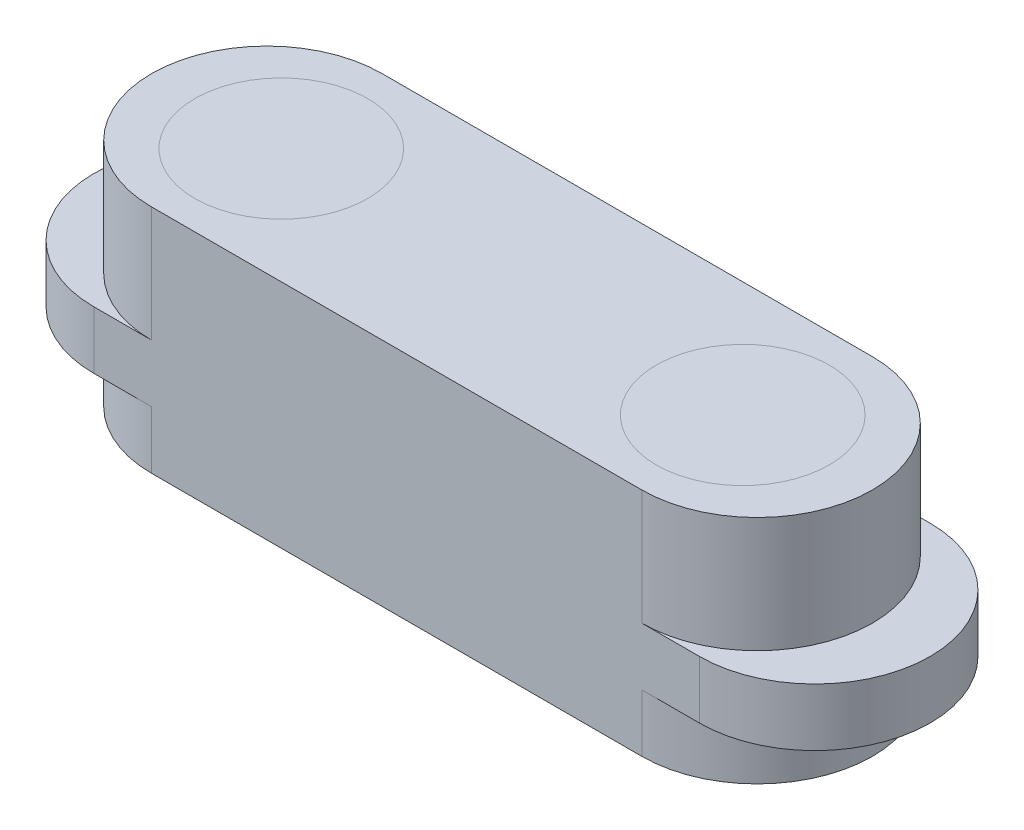
ISO-10303-21;
HEADER;
FILE_DESCRIPTION(('STEP AP214'),'2;1');
FILE_NAME('part.step','',(''),(''),'','','');
FILE_SCHEMA(('AUTOMOTIVE_DESIGN { 1 0 10303 214 1 1 1 1 }'));
ENDSEC;
DATA;
#1=APPLICATION_CONTEXT('core data for automotive mechanical design processes');
#2=APPLICATION_PROTOCOL_DEFINITION('international standard','automotive_design',2000,#1);
#3=PRODUCT_CONTEXT('',#1,'mechanical');
#4=PRODUCT('Part','Part','',(#3));
#5=PRODUCT_RELATED_PRODUCT_CATEGORY('part','',(#4));
#6=PRODUCT_DEFINITION_FORMATION('','',#4);
#7=PRODUCT_DEFINITION_CONTEXT('part definition',#1,'design');
#8=PRODUCT_DEFINITION('design','',#6,#7);
#9=PRODUCT_DEFINITION_SHAPE('','',#8);
#10=(LENGTH_UNIT() NAMED_UNIT(*) SI_UNIT(.MILLI.,.METRE.));
#11=(NAMED_UNIT(*) PLANE_ANGLE_UNIT() SI_UNIT($,.RADIAN.));
#12=(NAMED_UNIT(*) SI_UNIT($,.STERADIAN.) SOLID_ANGLE_UNIT());
#13=UNCERTAINTY_MEASURE_WITH_UNIT(LENGTH_MEASURE(1.E-05),#10,'distance_accuracy_value','');
#14=(GEOMETRIC_REPRESENTATION_CONTEXT(3) GLOBAL_UNCERTAINTY_ASSIGNED_CONTEXT((#13)) GLOBAL_UNIT_ASSIGNED_CONTEXT((#10,
#11,#12)) REPRESENTATION_CONTEXT('',''));
#15=CARTESIAN_POINT('',(0.,0.,0.));
#16=DIRECTION('',(0.,0.,1.));
#17=DIRECTION('',(1.,0.,0.));
#18=AXIS2_PLACEMENT_3D('',#15,#16,#17);
#19=CARTESIAN_POINT('',(9.25,7.24264068711929,0.));
#20=DIRECTION('',(0.,-1.,0.));
#21=DIRECTION('',(0.,0.,-1.));
#22=AXIS2_PLACEMENT_3D('',#19,#20,#21);
#23=CYLINDRICAL_SURFACE('',#22,1.5);
#24=CARTESIAN_POINT('',(9.25,2.,0.));
#25=DIRECTION('',(0.,1.,0.));
#26=DIRECTION('',(0.,0.,1.));
#27=AXIS2_PLACEMENT_3D('',#24,#25,#26);
#28=CIRCLE('',#27,1.5);
#29=CARTESIAN_POINT('',(9.25,2.,1.5));
#30=VERTEX_POINT('',#29);
#31=EDGE_CURVE('E11',#30,#30,#28,.T.);
#32=ORIENTED_EDGE('',*,*,#31,.T.);
#33=EDGE_LOOP('',(#32));
#34=FACE_BOUND('',#33,.T.);
#35=CARTESIAN_POINT('',(9.25,3.,0.));
#36=DIRECTION('',(0.,1.,0.));
#37=DIRECTION('',(0.,0.,1.));
#38=AXIS2_PLACEMENT_3D('',#35,#36,#37);
#39=CIRCLE('',#38,1.5);
#40=CARTESIAN_POINT('',(9.25,3.,1.5));
#41=VERTEX_POINT('',#40);
#42=EDGE_CURVE('E59',#41,#41,#39,.T.);
#43=ORIENTED_EDGE('',*,*,#42,.F.);
#44=EDGE_LOOP('',(#43));
#45=FACE_BOUND('',#44,.T.);
#46=ADVANCED_FACE('F52',(#34,#45),#23,.T.);
#47=CARTESIAN_POINT('',(9.25,2.,0.));
#48=DIRECTION('',(0.,1.,0.));
#49=DIRECTION('',(0.,0.,1.));
#50=AXIS2_PLACEMENT_3D('',#47,#48,#49);
#51=PLANE('',#50);
#52=ORIENTED_EDGE('',*,*,#31,.F.);
#53=EDGE_LOOP('',(#52));
#54=FACE_BOUND('',#53,.T.);
#55=ADVANCED_FACE('F54',(#54),#51,.F.);
#56=CARTESIAN_POINT('',(1.,3.,0.));
#57=DIRECTION('',(0.,1.,0.));
#58=DIRECTION('',(0.,0.,1.));
#59=AXIS2_PLACEMENT_3D('',#56,#57,#58);
#60=PLANE('',#59);
#61=ORIENTED_EDGE('',*,*,#42,.T.);
#62=EDGE_LOOP('',(#61));
#63=FACE_BOUND('',#62,.T.);
#64=ADVANCED_FACE('F65',(#63),#60,.T.);
#65=CLOSED_SHELL('',(#46,#55,#64));
#66=MANIFOLD_SOLID_BREP('B2',#65);
#67=CARTESIAN_POINT('',(1.25,7.24264068711929,0.));
#68=DIRECTION('',(0.,-1.,0.));
#69=DIRECTION('',(0.,0.,-1.));
#70=AXIS2_PLACEMENT_3D('',#67,#68,#69);
#71=CYLINDRICAL_SURFACE('',#70,1.5);
#72=CARTESIAN_POINT('',(1.25,2.,0.));
#73=DIRECTION('',(0.,1.,0.));
#74=DIRECTION('',(0.,0.,1.));
#75=AXIS2_PLACEMENT_3D('',#72,#73,#74);
#76=CIRCLE('',#75,1.5);
#77=CARTESIAN_POINT('',(1.25,2.,1.5));
#78=VERTEX_POINT('',#77);
#79=EDGE_CURVE('E122',#78,#78,#76,.T.);
#80=ORIENTED_EDGE('',*,*,#79,.T.);
#81=EDGE_LOOP('',(#80));
#82=FACE_BOUND('',#81,.T.);
#83=CARTESIAN_POINT('',(1.25,3.,0.));
#84=DIRECTION('',(0.,1.,0.));
#85=DIRECTION('',(0.,0.,1.));
#86=AXIS2_PLACEMENT_3D('',#83,#84,#85);
#87=CIRCLE('',#86,1.5);
#88=CARTESIAN_POINT('',(1.25,3.,1.5));
#89=VERTEX_POINT('',#88);
#90=EDGE_CURVE('E51',#89,#89,#87,.T.);
#91=ORIENTED_EDGE('',*,*,#90,.F.);
#92=EDGE_LOOP('',(#91));
#93=FACE_BOUND('',#92,.T.);
#94=ADVANCED_FACE('F115',(#82,#93),#71,.T.);
#95=CARTESIAN_POINT('',(1.25,2.,0.));
#96=DIRECTION('',(0.,1.,0.));
#97=DIRECTION('',(0.,0.,1.));
#98=AXIS2_PLACEMENT_3D('',#95,#96,#97);
#99=PLANE('',#98);
#100=ORIENTED_EDGE('',*,*,#79,.F.);
#101=EDGE_LOOP('',(#100));
#102=FACE_BOUND('',#101,.T.);
#103=ADVANCED_FACE('F130',(#102),#99,.F.);
#104=CARTESIAN_POINT('',(1.,3.,0.));
#105=DIRECTION('',(0.,1.,0.));
#106=DIRECTION('',(0.,0.,1.));
#107=AXIS2_PLACEMENT_3D('',#104,#105,#106);
#108=PLANE('',#107);
#109=ORIENTED_EDGE('',*,*,#90,.T.);
#110=EDGE_LOOP('',(#109));
#111=FACE_BOUND('',#110,.T.);
#112=ADVANCED_FACE('F117',(#111),#108,.T.);
#113=CLOSED_SHELL('',(#94,#103,#112));
#114=MANIFOLD_SOLID_BREP('B6',#113);
#115=CARTESIAN_POINT('',(0.,0.,0.));
#116=DIRECTION('',(0.,1.,0.));
#117=DIRECTION('',(0.,0.,1.));
#118=AXIS2_PLACEMENT_3D('',#115,#116,#117);
#119=PLANE('',#118);
#120=CARTESIAN_POINT('',(0.999999999999997,0.,0.));
#121=DIRECTION('',(0.,-1.,0.));
#122=DIRECTION('',(0.,0.,1.));
#123=AXIS2_PLACEMENT_3D('',#120,#121,#122);
#124=CIRCLE('',#123,2.);
#125=CARTESIAN_POINT('',(0.999999999999997,0.,2.));
#126=VERTEX_POINT('',#125);
#127=CARTESIAN_POINT('',(0.999999999999997,0.,-2.));
#128=VERTEX_POINT('',#127);
#129=EDGE_CURVE('E186',#126,#128,#124,.T.);
#130=ORIENTED_EDGE('',*,*,#129,.F.);
#131=DIRECTION('',(1.,0.,0.));
#132=VECTOR('',#131,1.);
#133=CARTESIAN_POINT('',(0.,0.,2.));
#134=LINE('',#133,#132);
#135=CARTESIAN_POINT('',(0.,0.,2.));
#136=VERTEX_POINT('',#135);
#137=EDGE_CURVE('E342',#136,#126,#134,.T.);
#138=ORIENTED_EDGE('',*,*,#137,.F.);
#139=CARTESIAN_POINT('',(0.,0.,0.));
#140=DIRECTION('',(0.,1.,0.));
#141=DIRECTION('',(0.,0.,1.));
#142=AXIS2_PLACEMENT_3D('',#139,#140,#141);
#143=CIRCLE('',#142,2.);
#144=CARTESIAN_POINT('',(0.,0.,-2.));
#145=VERTEX_POINT('',#144);
#146=EDGE_CURVE('E325',#145,#136,#143,.T.);
#147=ORIENTED_EDGE('',*,*,#146,.F.);
#148=DIRECTION('',(-1.,0.,0.));
#149=VECTOR('',#148,1.);
#150=CARTESIAN_POINT('',(0.,0.,-2.));
#151=LINE('',#150,#149);
#152=EDGE_CURVE('E191',#128,#145,#151,.T.);
#153=ORIENTED_EDGE('',*,*,#152,.F.);
#154=EDGE_LOOP('',(#130,#138,#147,#153));
#155=FACE_BOUND('',#154,.T.);
#156=ADVANCED_FACE('F169',(#155),#119,.F.);
#157=CARTESIAN_POINT('',(0.,1.,0.));
#158=DIRECTION('',(0.,1.,0.));
#159=DIRECTION('',(0.,0.,1.));
#160=AXIS2_PLACEMENT_3D('',#157,#158,#159);
#161=PLANE('',#160);
#162=CARTESIAN_POINT('',(1.,1.,0.));
#163=DIRECTION('',(0.,1.,0.));
#164=DIRECTION('',(0.,0.,1.));
#165=AXIS2_PLACEMENT_3D('',#162,#163,#164);
#166=CIRCLE('',#165,2.);
#167=CARTESIAN_POINT('',(1.,1.,-2.));
#168=VERTEX_POINT('',#167);
#169=CARTESIAN_POINT('',(1.,1.,2.));
#170=VERTEX_POINT('',#169);
#171=EDGE_CURVE('E293',#168,#170,#166,.T.);
#172=ORIENTED_EDGE('',*,*,#171,.F.);
#173=DIRECTION('',(-1.,0.,0.));
#174=VECTOR('',#173,1.);
#175=CARTESIAN_POINT('',(0.,1.,-2.));
#176=LINE('',#175,#174);
#177=CARTESIAN_POINT('',(0.,1.,-2.));
#178=VERTEX_POINT('',#177);
#179=EDGE_CURVE('E335',#168,#178,#176,.T.);
#180=ORIENTED_EDGE('',*,*,#179,.T.);
#181=CARTESIAN_POINT('',(0.,1.,0.));
#182=DIRECTION('',(0.,1.,0.));
#183=DIRECTION('',(0.,0.,1.));
#184=AXIS2_PLACEMENT_3D('',#181,#182,#183);
#185=CIRCLE('',#184,2.);
#186=CARTESIAN_POINT('',(0.,1.,2.));
#187=VERTEX_POINT('',#186);
#188=EDGE_CURVE('E326',#178,#187,#185,.T.);
#189=ORIENTED_EDGE('',*,*,#188,.T.);
#190=DIRECTION('',(1.,0.,0.));
#191=VECTOR('',#190,1.);
#192=CARTESIAN_POINT('',(0.,1.,2.));
#193=LINE('',#192,#191);
#194=EDGE_CURVE('E331',#187,#170,#193,.T.);
#195=ORIENTED_EDGE('',*,*,#194,.T.);
#196=EDGE_LOOP('',(#172,#180,#189,#195));
#197=FACE_BOUND('',#196,.T.);
#198=ADVANCED_FACE('F405',(#197),#161,.T.);
#199=CARTESIAN_POINT('',(0.,1.,0.));
#200=DIRECTION('',(0.,-1.,0.));
#201=DIRECTION('',(0.,0.,-1.));
#202=AXIS2_PLACEMENT_3D('',#199,#200,#201);
#203=CYLINDRICAL_SURFACE('',#202,2.);
#204=ORIENTED_EDGE('',*,*,#146,.T.);
#205=DIRECTION('',(0.,-1.,0.));
#206=VECTOR('',#205,1.);
#207=CARTESIAN_POINT('',(0.,1.,2.));
#208=LINE('',#207,#206);
#209=EDGE_CURVE('E113',#187,#136,#208,.T.);
#210=ORIENTED_EDGE('',*,*,#209,.F.);
#211=ORIENTED_EDGE('',*,*,#188,.F.);
#212=DIRECTION('',(0.,-1.,0.));
#213=VECTOR('',#212,1.);
#214=CARTESIAN_POINT('',(0.,1.,-2.));
#215=LINE('',#214,#213);
#216=EDGE_CURVE('E338',#178,#145,#215,.T.);
#217=ORIENTED_EDGE('',*,*,#216,.T.);
#218=EDGE_LOOP('',(#204,#210,#211,#217));
#219=FACE_BOUND('',#218,.T.);
#220=ADVANCED_FACE('F171',(#219),#203,.T.);
#221=CARTESIAN_POINT('',(0.,1.,2.));
#222=DIRECTION('',(0.,0.,-1.));
#223=DIRECTION('',(-1.,0.,0.));
#224=AXIS2_PLACEMENT_3D('',#221,#222,#223);
#225=PLANE('',#224);
#226=ORIENTED_EDGE('',*,*,#137,.T.);
#227=DIRECTION('',(0.,1.,0.));
#228=VECTOR('',#227,1.);
#229=CARTESIAN_POINT('',(0.999999999999993,-1.,2.));
#230=LINE('',#229,#228);
#231=CARTESIAN_POINT('',(0.999999999999993,-1.,2.));
#232=VERTEX_POINT('',#231);
#233=EDGE_CURVE('E368',#232,#126,#230,.T.);
#234=ORIENTED_EDGE('',*,*,#233,.F.);
#235=DIRECTION('',(-1.,0.,0.));
#236=VECTOR('',#235,1.);
#237=CARTESIAN_POINT('',(0.999999999999993,-1.,2.));
#238=LINE('',#237,#236);
#239=CARTESIAN_POINT('',(9.5,-1.,2.));
#240=VERTEX_POINT('',#239);
#241=EDGE_CURVE('E274',#240,#232,#238,.T.);
#242=ORIENTED_EDGE('',*,*,#241,.F.);
#243=DIRECTION('',(0.,1.,0.));
#244=VECTOR('',#243,1.);
#245=CARTESIAN_POINT('',(9.5,-1.,2.));
#246=LINE('',#245,#244);
#247=CARTESIAN_POINT('',(9.5,0.,2.));
#248=VERTEX_POINT('',#247);
#249=EDGE_CURVE('E286',#240,#248,#246,.T.);
#250=ORIENTED_EDGE('',*,*,#249,.T.);
#251=CARTESIAN_POINT('',(10.5,0.,2.));
#252=VERTEX_POINT('',#251);
#253=EDGE_CURVE('E341',#248,#252,#134,.T.);
#254=ORIENTED_EDGE('',*,*,#253,.T.);
#255=DIRECTION('',(0.,-1.,0.));
#256=VECTOR('',#255,1.);
#257=CARTESIAN_POINT('',(10.5,1.,2.));
#258=LINE('',#257,#256);
#259=CARTESIAN_POINT('',(10.5,1.,2.));
#260=VERTEX_POINT('',#259);
#261=EDGE_CURVE('E178',#260,#252,#258,.T.);
#262=ORIENTED_EDGE('',*,*,#261,.F.);
#263=CARTESIAN_POINT('',(9.5,1.,2.));
#264=VERTEX_POINT('',#263);
#265=EDGE_CURVE('E329',#264,#260,#193,.T.);
#266=ORIENTED_EDGE('',*,*,#265,.F.);
#267=DIRECTION('',(0.,-1.,0.));
#268=VECTOR('',#267,1.);
#269=CARTESIAN_POINT('',(9.5,3.,2.));
#270=LINE('',#269,#268);
#271=CARTESIAN_POINT('',(9.5,3.,2.));
#272=VERTEX_POINT('',#271);
#273=EDGE_CURVE('E319',#272,#264,#270,.T.);
#274=ORIENTED_EDGE('',*,*,#273,.F.);
#275=DIRECTION('',(1.,0.,0.));
#276=VECTOR('',#275,1.);
#277=CARTESIAN_POINT('',(1.,3.,2.));
#278=LINE('',#277,#276);
#279=CARTESIAN_POINT('',(1.,3.,2.));
#280=VERTEX_POINT('',#279);
#281=EDGE_CURVE('E302',#280,#272,#278,.T.);
#282=ORIENTED_EDGE('',*,*,#281,.F.);
#283=DIRECTION('',(0.,-1.,0.));
#284=VECTOR('',#283,1.);
#285=CARTESIAN_POINT('',(1.,3.,2.));
#286=LINE('',#285,#284);
#287=EDGE_CURVE('E322',#280,#170,#286,.T.);
#288=ORIENTED_EDGE('',*,*,#287,.T.);
#289=ORIENTED_EDGE('',*,*,#194,.F.);
#290=ORIENTED_EDGE('',*,*,#209,.T.);
#291=EDGE_LOOP('',(#226,#234,#242,#250,#254,#262,#266,#274,#282,#288,#289,#290));
#292=FACE_BOUND('',#291,.T.);
#293=ADVANCED_FACE('F375',(#292),#225,.F.);
#294=CARTESIAN_POINT('',(10.5,1.,0.));
#295=DIRECTION('',(0.,-1.,0.));
#296=DIRECTION('',(0.,0.,-1.));
#297=AXIS2_PLACEMENT_3D('',#294,#295,#296);
#298=CYLINDRICAL_SURFACE('',#297,2.);
#299=CARTESIAN_POINT('',(10.5,0.,0.));
#300=DIRECTION('',(0.,1.,0.));
#301=DIRECTION('',(0.,0.,1.));
#302=AXIS2_PLACEMENT_3D('',#299,#300,#301);
#303=CIRCLE('',#302,2.);
#304=CARTESIAN_POINT('',(10.5,0.,-2.));
#305=VERTEX_POINT('',#304);
#306=EDGE_CURVE('E344',#252,#305,#303,.T.);
#307=ORIENTED_EDGE('',*,*,#306,.T.);
#308=DIRECTION('',(0.,-1.,0.));
#309=VECTOR('',#308,1.);
#310=CARTESIAN_POINT('',(10.5,1.,-2.));
#311=LINE('',#310,#309);
#312=CARTESIAN_POINT('',(10.5,1.,-2.));
#313=VERTEX_POINT('',#312);
#314=EDGE_CURVE('E349',#313,#305,#311,.T.);
#315=ORIENTED_EDGE('',*,*,#314,.F.);
#316=CARTESIAN_POINT('',(10.5,1.,0.));
#317=DIRECTION('',(0.,1.,0.));
#318=DIRECTION('',(0.,0.,1.));
#319=AXIS2_PLACEMENT_3D('',#316,#317,#318);
#320=CIRCLE('',#319,2.);
#321=EDGE_CURVE('E333',#260,#313,#320,.T.);
#322=ORIENTED_EDGE('',*,*,#321,.F.);
#323=ORIENTED_EDGE('',*,*,#261,.T.);
#324=EDGE_LOOP('',(#307,#315,#322,#323));
#325=FACE_BOUND('',#324,.T.);
#326=ADVANCED_FACE('F387',(#325),#298,.T.);
#327=CARTESIAN_POINT('',(0.,1.,-2.));
#328=DIRECTION('',(0.,0.,1.));
#329=DIRECTION('',(1.,0.,0.));
#330=AXIS2_PLACEMENT_3D('',#327,#328,#329);
#331=PLANE('',#330);
#332=CARTESIAN_POINT('',(9.50000000000001,0.,-2.));
#333=VERTEX_POINT('',#332);
#334=EDGE_CURVE('E330',#305,#333,#151,.T.);
#335=ORIENTED_EDGE('',*,*,#334,.T.);
#336=DIRECTION('',(0.,1.,0.));
#337=VECTOR('',#336,1.);
#338=CARTESIAN_POINT('',(9.50000000000002,-1.,-2.));
#339=LINE('',#338,#337);
#340=CARTESIAN_POINT('',(9.50000000000002,-1.,-2.));
#341=VERTEX_POINT('',#340);
#342=EDGE_CURVE('E265',#341,#333,#339,.T.);
#343=ORIENTED_EDGE('',*,*,#342,.F.);
#344=DIRECTION('',(1.,0.,0.));
#345=VECTOR('',#344,1.);
#346=CARTESIAN_POINT('',(9.50000000000002,-1.,-2.));
#347=LINE('',#346,#345);
#348=CARTESIAN_POINT('',(1.,-1.,-2.));
#349=VERTEX_POINT('',#348);
#350=EDGE_CURVE('E258',#349,#341,#347,.T.);
#351=ORIENTED_EDGE('',*,*,#350,.F.);
#352=DIRECTION('',(0.,1.,0.));
#353=VECTOR('',#352,1.);
#354=CARTESIAN_POINT('',(1.,-1.,-2.));
#355=LINE('',#354,#353);
#356=EDGE_CURVE('E263',#349,#128,#355,.T.);
#357=ORIENTED_EDGE('',*,*,#356,.T.);
#358=ORIENTED_EDGE('',*,*,#152,.T.);
#359=ORIENTED_EDGE('',*,*,#216,.F.);
#360=ORIENTED_EDGE('',*,*,#179,.F.);
#361=DIRECTION('',(0.,-1.,0.));
#362=VECTOR('',#361,1.);
#363=CARTESIAN_POINT('',(1.,3.,-2.));
#364=LINE('',#363,#362);
#365=CARTESIAN_POINT('',(1.,3.,-2.));
#366=VERTEX_POINT('',#365);
#367=EDGE_CURVE('E309',#366,#168,#364,.T.);
#368=ORIENTED_EDGE('',*,*,#367,.F.);
#369=DIRECTION('',(-1.,0.,0.));
#370=VECTOR('',#369,1.);
#371=CARTESIAN_POINT('',(1.,3.,-2.));
#372=LINE('',#371,#370);
#373=CARTESIAN_POINT('',(9.5,3.,-2.));
#374=VERTEX_POINT('',#373);
#375=EDGE_CURVE('E307',#374,#366,#372,.T.);
#376=ORIENTED_EDGE('',*,*,#375,.F.);
#377=DIRECTION('',(0.,-1.,0.));
#378=VECTOR('',#377,1.);
#379=CARTESIAN_POINT('',(9.5,3.,-2.));
#380=LINE('',#379,#378);
#381=CARTESIAN_POINT('',(9.5,1.,-2.));
#382=VERTEX_POINT('',#381);
#383=EDGE_CURVE('E316',#374,#382,#380,.T.);
#384=ORIENTED_EDGE('',*,*,#383,.T.);
#385=EDGE_CURVE('E336',#313,#382,#176,.T.);
#386=ORIENTED_EDGE('',*,*,#385,.F.);
#387=ORIENTED_EDGE('',*,*,#314,.T.);
#388=EDGE_LOOP('',(#335,#343,#351,#357,#358,#359,#360,#368,#376,#384,#386,#387));
#389=FACE_BOUND('',#388,.T.);
#390=ADVANCED_FACE('F261',(#389),#331,.F.);
#391=CARTESIAN_POINT('',(9.5,1.,0.));
#392=DIRECTION('',(0.,1.,0.));
#393=DIRECTION('',(0.,0.,1.));
#394=AXIS2_PLACEMENT_3D('',#391,#392,#393);
#395=CIRCLE('',#394,2.);
#396=EDGE_CURVE('E303',#264,#382,#395,.T.);
#397=ORIENTED_EDGE('',*,*,#396,.F.);
#398=ORIENTED_EDGE('',*,*,#265,.T.);
#399=ORIENTED_EDGE('',*,*,#321,.T.);
#400=ORIENTED_EDGE('',*,*,#385,.T.);
#401=EDGE_LOOP('',(#397,#398,#399,#400));
#402=FACE_BOUND('',#401,.T.);
#403=ADVANCED_FACE('F418',(#402),#161,.T.);
#404=CARTESIAN_POINT('',(9.50000000000001,0.,0.));
#405=DIRECTION('',(0.,-1.,0.));
#406=DIRECTION('',(0.,0.,1.));
#407=AXIS2_PLACEMENT_3D('',#404,#405,#406);
#408=CIRCLE('',#407,2.);
#409=EDGE_CURVE('E278',#333,#248,#408,.T.);
#410=ORIENTED_EDGE('',*,*,#409,.F.);
#411=ORIENTED_EDGE('',*,*,#334,.F.);
#412=ORIENTED_EDGE('',*,*,#306,.F.);
#413=ORIENTED_EDGE('',*,*,#253,.F.);
#414=EDGE_LOOP('',(#410,#411,#412,#413));
#415=FACE_BOUND('',#414,.T.);
#416=ADVANCED_FACE('F381',(#415),#119,.F.);
#417=CARTESIAN_POINT('',(1.,3.,0.));
#418=DIRECTION('',(0.,-1.,0.));
#419=DIRECTION('',(0.,0.,-1.));
#420=AXIS2_PLACEMENT_3D('',#417,#418,#419);
#421=CYLINDRICAL_SURFACE('',#420,2.);
#422=ORIENTED_EDGE('',*,*,#171,.T.);
#423=ORIENTED_EDGE('',*,*,#287,.F.);
#424=CARTESIAN_POINT('',(1.,3.,0.));
#425=DIRECTION('',(0.,1.,0.));
#426=DIRECTION('',(0.,0.,1.));
#427=AXIS2_PLACEMENT_3D('',#424,#425,#426);
#428=CIRCLE('',#427,2.);
#429=EDGE_CURVE('E299',#366,#280,#428,.T.);
#430=ORIENTED_EDGE('',*,*,#429,.F.);
#431=ORIENTED_EDGE('',*,*,#367,.T.);
#432=EDGE_LOOP('',(#422,#423,#430,#431));
#433=FACE_BOUND('',#432,.T.);
#434=ADVANCED_FACE('F402',(#433),#421,.T.);
#435=CARTESIAN_POINT('',(9.5,3.,0.));
#436=DIRECTION('',(0.,-1.,0.));
#437=DIRECTION('',(0.,0.,-1.));
#438=AXIS2_PLACEMENT_3D('',#435,#436,#437);
#439=CYLINDRICAL_SURFACE('',#438,2.);
#440=ORIENTED_EDGE('',*,*,#396,.T.);
#441=ORIENTED_EDGE('',*,*,#383,.F.);
#442=CARTESIAN_POINT('',(9.5,3.,0.));
#443=DIRECTION('',(0.,1.,0.));
#444=DIRECTION('',(0.,0.,1.));
#445=AXIS2_PLACEMENT_3D('',#442,#443,#444);
#446=CIRCLE('',#445,2.);
#447=EDGE_CURVE('E305',#272,#374,#446,.T.);
#448=ORIENTED_EDGE('',*,*,#447,.F.);
#449=ORIENTED_EDGE('',*,*,#273,.T.);
#450=EDGE_LOOP('',(#440,#441,#448,#449));
#451=FACE_BOUND('',#450,.T.);
#452=ADVANCED_FACE('F393',(#451),#439,.T.);
#453=CARTESIAN_POINT('',(1.,3.,0.));
#454=DIRECTION('',(0.,1.,0.));
#455=DIRECTION('',(0.,0.,1.));
#456=AXIS2_PLACEMENT_3D('',#453,#454,#455);
#457=PLANE('',#456);
#458=CARTESIAN_POINT('',(1.25,3.,0.));
#459=DIRECTION('',(0.,1.,0.));
#460=DIRECTION('',(0.,0.,1.));
#461=AXIS2_PLACEMENT_3D('',#458,#459,#460);
#462=CIRCLE('',#461,1.5);
#463=CARTESIAN_POINT('',(1.25,3.,1.5));
#464=VERTEX_POINT('',#463);
#465=EDGE_CURVE('E294',#464,#464,#462,.T.);
#466=ORIENTED_EDGE('',*,*,#465,.F.);
#467=EDGE_LOOP('',(#466));
#468=FACE_BOUND('',#467,.T.);
#469=CARTESIAN_POINT('',(9.25,3.,0.));
#470=DIRECTION('',(0.,1.,0.));
#471=DIRECTION('',(0.,0.,1.));
#472=AXIS2_PLACEMENT_3D('',#469,#470,#471);
#473=CIRCLE('',#472,1.5);
#474=CARTESIAN_POINT('',(9.25,3.,1.5));
#475=VERTEX_POINT('',#474);
#476=EDGE_CURVE('E284',#475,#475,#473,.T.);
#477=ORIENTED_EDGE('',*,*,#476,.F.);
#478=EDGE_LOOP('',(#477));
#479=FACE_BOUND('',#478,.T.);
#480=ORIENTED_EDGE('',*,*,#429,.T.);
#481=ORIENTED_EDGE('',*,*,#281,.T.);
#482=ORIENTED_EDGE('',*,*,#447,.T.);
#483=ORIENTED_EDGE('',*,*,#375,.T.);
#484=EDGE_LOOP('',(#480,#481,#482,#483));
#485=FACE_BOUND('',#484,.T.);
#486=ADVANCED_FACE('F397',(#468,#479,#485),#457,.T.);
#487=CARTESIAN_POINT('',(9.25,2.,0.));
#488=DIRECTION('',(0.,1.,0.));
#489=DIRECTION('',(0.,0.,1.));
#490=AXIS2_PLACEMENT_3D('',#487,#488,#489);
#491=CYLINDRICAL_SURFACE('',#490,1.5);
#492=CARTESIAN_POINT('',(9.25,2.,0.));
#493=DIRECTION('',(0.,1.,0.));
#494=DIRECTION('',(0.,0.,1.));
#495=AXIS2_PLACEMENT_3D('',#492,#493,#494);
#496=CIRCLE('',#495,1.5);
#497=CARTESIAN_POINT('',(9.25,2.,1.5));
#498=VERTEX_POINT('',#497);
#499=EDGE_CURVE('E281',#498,#498,#496,.T.);
#500=ORIENTED_EDGE('',*,*,#499,.F.);
#501=EDGE_LOOP('',(#500));
#502=FACE_BOUND('',#501,.T.);
#503=ORIENTED_EDGE('',*,*,#476,.T.);
#504=EDGE_LOOP('',(#503));
#505=FACE_BOUND('',#504,.T.);
#506=ADVANCED_FACE('F436',(#502,#505),#491,.F.);
#507=CARTESIAN_POINT('',(9.25,2.,0.));
#508=DIRECTION('',(0.,1.,0.));
#509=DIRECTION('',(0.,0.,1.));
#510=AXIS2_PLACEMENT_3D('',#507,#508,#509);
#511=PLANE('',#510);
#512=ORIENTED_EDGE('',*,*,#499,.T.);
#513=EDGE_LOOP('',(#512));
#514=FACE_BOUND('',#513,.T.);
#515=ADVANCED_FACE('F438',(#514),#511,.T.);
#516=CARTESIAN_POINT('',(1.25,2.,0.));
#517=DIRECTION('',(0.,1.,0.));
#518=DIRECTION('',(0.,0.,1.));
#519=AXIS2_PLACEMENT_3D('',#516,#517,#518);
#520=CYLINDRICAL_SURFACE('',#519,1.5);
#521=CARTESIAN_POINT('',(1.25,2.,0.));
#522=DIRECTION('',(0.,1.,0.));
#523=DIRECTION('',(0.,0.,1.));
#524=AXIS2_PLACEMENT_3D('',#521,#522,#523);
#525=CIRCLE('',#524,1.5);
#526=CARTESIAN_POINT('',(1.25,2.,1.5));
#527=VERTEX_POINT('',#526);
#528=EDGE_CURVE('E290',#527,#527,#525,.T.);
#529=ORIENTED_EDGE('',*,*,#528,.F.);
#530=EDGE_LOOP('',(#529));
#531=FACE_BOUND('',#530,.T.);
#532=ORIENTED_EDGE('',*,*,#465,.T.);
#533=EDGE_LOOP('',(#532));
#534=FACE_BOUND('',#533,.T.);
#535=ADVANCED_FACE('F441',(#531,#534),#520,.F.);
#536=CARTESIAN_POINT('',(1.25,2.,0.));
#537=DIRECTION('',(0.,1.,0.));
#538=DIRECTION('',(0.,0.,1.));
#539=AXIS2_PLACEMENT_3D('',#536,#537,#538);
#540=PLANE('',#539);
#541=ORIENTED_EDGE('',*,*,#528,.T.);
#542=EDGE_LOOP('',(#541));
#543=FACE_BOUND('',#542,.T.);
#544=ADVANCED_FACE('F448',(#543),#540,.T.);
#545=CARTESIAN_POINT('',(0.999999999999997,-1.,0.));
#546=DIRECTION('',(0.,1.,0.));
#547=DIRECTION('',(0.,0.,1.));
#548=AXIS2_PLACEMENT_3D('',#545,#546,#547);
#549=CYLINDRICAL_SURFACE('',#548,2.);
#550=ORIENTED_EDGE('',*,*,#129,.T.);
#551=ORIENTED_EDGE('',*,*,#356,.F.);
#552=CARTESIAN_POINT('',(0.999999999999997,-1.,0.));
#553=DIRECTION('',(0.,-1.,0.));
#554=DIRECTION('',(0.,0.,1.));
#555=AXIS2_PLACEMENT_3D('',#552,#553,#554);
#556=CIRCLE('',#555,2.);
#557=EDGE_CURVE('E269',#232,#349,#556,.T.);
#558=ORIENTED_EDGE('',*,*,#557,.F.);
#559=ORIENTED_EDGE('',*,*,#233,.T.);
#560=EDGE_LOOP('',(#550,#551,#558,#559));
#561=FACE_BOUND('',#560,.T.);
#562=ADVANCED_FACE('F280',(#561),#549,.T.);
#563=CARTESIAN_POINT('',(9.50000000000001,-1.,0.));
#564=DIRECTION('',(0.,1.,0.));
#565=DIRECTION('',(0.,0.,1.));
#566=AXIS2_PLACEMENT_3D('',#563,#564,#565);
#567=CYLINDRICAL_SURFACE('',#566,2.);
#568=ORIENTED_EDGE('',*,*,#409,.T.);
#569=ORIENTED_EDGE('',*,*,#249,.F.);
#570=CARTESIAN_POINT('',(9.50000000000001,-1.,0.));
#571=DIRECTION('',(0.,-1.,0.));
#572=DIRECTION('',(0.,0.,1.));
#573=AXIS2_PLACEMENT_3D('',#570,#571,#572);
#574=CIRCLE('',#573,2.);
#575=EDGE_CURVE('E268',#341,#240,#574,.T.);
#576=ORIENTED_EDGE('',*,*,#575,.F.);
#577=ORIENTED_EDGE('',*,*,#342,.T.);
#578=EDGE_LOOP('',(#568,#569,#576,#577));
#579=FACE_BOUND('',#578,.T.);
#580=ADVANCED_FACE('F378',(#579),#567,.T.);
#581=CARTESIAN_POINT('',(0.999999999999997,-1.,0.));
#582=DIRECTION('',(0.,1.,0.));
#583=DIRECTION('',(0.,0.,1.));
#584=AXIS2_PLACEMENT_3D('',#581,#582,#583);
#585=PLANE('',#584);
#586=CARTESIAN_POINT('',(6.5,-1.,0.));
#587=DIRECTION('',(0.,1.,0.));
#588=DIRECTION('',(0.,0.,1.));
#589=AXIS2_PLACEMENT_3D('',#586,#587,#588);
#590=CIRCLE('',#589,0.45);
#591=CARTESIAN_POINT('',(6.5,-1.,0.45));
#592=VERTEX_POINT('',#591);
#593=EDGE_CURVE('E173',#592,#592,#590,.T.);
#594=ORIENTED_EDGE('',*,*,#593,.T.);
#595=EDGE_LOOP('',(#594));
#596=FACE_BOUND('',#595,.T.);
#597=CARTESIAN_POINT('',(4.,-1.,0.));
#598=DIRECTION('',(0.,1.,0.));
#599=DIRECTION('',(0.,0.,1.));
#600=AXIS2_PLACEMENT_3D('',#597,#598,#599);
#601=CIRCLE('',#600,0.45);
#602=CARTESIAN_POINT('',(4.,-1.,0.45));
#603=VERTEX_POINT('',#602);
#604=EDGE_CURVE('E353',#603,#603,#601,.T.);
#605=ORIENTED_EDGE('',*,*,#604,.T.);
#606=EDGE_LOOP('',(#605));
#607=FACE_BOUND('',#606,.T.);
#608=ORIENTED_EDGE('',*,*,#557,.T.);
#609=ORIENTED_EDGE('',*,*,#350,.T.);
#610=ORIENTED_EDGE('',*,*,#575,.T.);
#611=ORIENTED_EDGE('',*,*,#241,.T.);
#612=EDGE_LOOP('',(#608,#609,#610,#611));
#613=FACE_BOUND('',#612,.T.);
#614=ADVANCED_FACE('F272',(#596,#607,#613),#585,.F.);
#615=CARTESIAN_POINT('',(0.,-2.5,0.));
#616=DIRECTION('',(0.,1.,0.));
#617=DIRECTION('',(0.,0.,1.));
#618=AXIS2_PLACEMENT_3D('',#615,#616,#617);
#619=PLANE('',#618);
#620=CARTESIAN_POINT('',(4.,-2.5,0.));
#621=DIRECTION('',(0.,1.,0.));
#622=DIRECTION('',(0.,0.,1.));
#623=AXIS2_PLACEMENT_3D('',#620,#621,#622);
#624=CIRCLE('',#623,0.45);
#625=CARTESIAN_POINT('',(4.,-2.5,0.45));
#626=VERTEX_POINT('',#625);
#627=EDGE_CURVE('E355',#626,#626,#624,.F.);
#628=ORIENTED_EDGE('',*,*,#627,.T.);
#629=EDGE_LOOP('',(#628));
#630=FACE_BOUND('',#629,.T.);
#631=ADVANCED_FACE('F459',(#630),#619,.F.);
#632=CARTESIAN_POINT('',(4.,-6.27279220613579,0.));
#633=DIRECTION('',(0.,1.,0.));
#634=DIRECTION('',(0.,0.,1.));
#635=AXIS2_PLACEMENT_3D('',#632,#633,#634);
#636=CYLINDRICAL_SURFACE('',#635,0.45);
#637=ORIENTED_EDGE('',*,*,#627,.F.);
#638=EDGE_LOOP('',(#637));
#639=FACE_BOUND('',#638,.T.);
#640=ORIENTED_EDGE('',*,*,#604,.F.);
#641=EDGE_LOOP('',(#640));
#642=FACE_BOUND('',#641,.T.);
#643=ADVANCED_FACE('F461',(#639,#642),#636,.T.);
#644=CARTESIAN_POINT('',(0.,-2.5,0.));
#645=DIRECTION('',(0.,1.,0.));
#646=DIRECTION('',(0.,0.,1.));
#647=AXIS2_PLACEMENT_3D('',#644,#645,#646);
#648=PLANE('',#647);
#649=CARTESIAN_POINT('',(6.5,-2.5,0.));
#650=DIRECTION('',(0.,1.,0.));
#651=DIRECTION('',(0.,0.,1.));
#652=AXIS2_PLACEMENT_3D('',#649,#650,#651);
#653=CIRCLE('',#652,0.45);
#654=CARTESIAN_POINT('',(6.5,-2.5,0.45));
#655=VERTEX_POINT('',#654);
#656=EDGE_CURVE('E364',#655,#655,#653,.F.);
#657=ORIENTED_EDGE('',*,*,#656,.T.);
#658=EDGE_LOOP('',(#657));
#659=FACE_BOUND('',#658,.T.);
#660=ADVANCED_FACE('F464',(#659),#648,.F.);
#661=CARTESIAN_POINT('',(6.5,-6.27279220613579,0.));
#662=DIRECTION('',(0.,1.,0.));
#663=DIRECTION('',(0.,0.,1.));
#664=AXIS2_PLACEMENT_3D('',#661,#662,#663);
#665=CYLINDRICAL_SURFACE('',#664,0.45);
#666=ORIENTED_EDGE('',*,*,#656,.F.);
#667=EDGE_LOOP('',(#666));
#668=FACE_BOUND('',#667,.T.);
#669=ORIENTED_EDGE('',*,*,#593,.F.);
#670=EDGE_LOOP('',(#669));
#671=FACE_BOUND('',#670,.T.);
#672=ADVANCED_FACE('F470',(#668,#671),#665,.T.);
#673=CLOSED_SHELL('',(#156,#198,#220,#293,#326,#390,#403,#416,#434,#452,#486,#506,#515,#535,
#544,#562,#580,#614,#631,#643,#660,#672));
#674=MANIFOLD_SOLID_BREP('B46',#673);
#675=ADVANCED_BREP_SHAPE_REPRESENTATION('',(#18,#66,#114,#674),#14);
#676=SHAPE_DEFINITION_REPRESENTATION(#9,#675);
ENDSEC;
END-ISO-10303-21;
